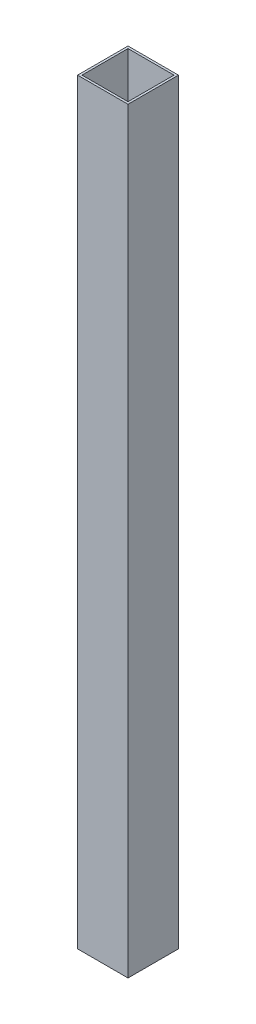
ISO-10303-21;
HEADER;
FILE_DESCRIPTION(('STEP AP214'),'2;1');
FILE_NAME('part.step','',(''),(''),'','','');
FILE_SCHEMA(('AUTOMOTIVE_DESIGN { 1 0 10303 214 1 1 1 1 }'));
ENDSEC;
DATA;
#1=APPLICATION_CONTEXT('core data for automotive mechanical design processes');
#2=APPLICATION_PROTOCOL_DEFINITION('international standard','automotive_design',2000,#1);
#3=PRODUCT_CONTEXT('',#1,'mechanical');
#4=PRODUCT('Part','Part','',(#3));
#5=PRODUCT_RELATED_PRODUCT_CATEGORY('part','',(#4));
#6=PRODUCT_DEFINITION_FORMATION('','',#4);
#7=PRODUCT_DEFINITION_CONTEXT('part definition',#1,'design');
#8=PRODUCT_DEFINITION('design','',#6,#7);
#9=PRODUCT_DEFINITION_SHAPE('','',#8);
#10=(LENGTH_UNIT() NAMED_UNIT(*) SI_UNIT(.MILLI.,.METRE.));
#11=(NAMED_UNIT(*) PLANE_ANGLE_UNIT() SI_UNIT($,.RADIAN.));
#12=(NAMED_UNIT(*) SI_UNIT($,.STERADIAN.) SOLID_ANGLE_UNIT());
#13=UNCERTAINTY_MEASURE_WITH_UNIT(LENGTH_MEASURE(1.E-05),#10,'distance_accuracy_value','');
#14=(GEOMETRIC_REPRESENTATION_CONTEXT(3) GLOBAL_UNCERTAINTY_ASSIGNED_CONTEXT((#13)) GLOBAL_UNIT_ASSIGNED_CONTEXT((#10,
#11,#12)) REPRESENTATION_CONTEXT('',''));
#15=CARTESIAN_POINT('',(0.,0.,0.));
#16=DIRECTION('',(0.,0.,1.));
#17=DIRECTION('',(1.,0.,0.));
#18=AXIS2_PLACEMENT_3D('',#15,#16,#17);
#19=CARTESIAN_POINT('',(0.,750.,0.));
#20=DIRECTION('',(0.,-1.,0.));
#21=DIRECTION('',(0.,0.,-1.));
#22=AXIS2_PLACEMENT_3D('',#19,#20,#21);
#23=PLANE('',#22);
#24=DIRECTION('',(1.,0.,0.));
#25=VECTOR('',#24,1.);
#26=CARTESIAN_POINT('',(50.,750.,0.));
#27=LINE('',#26,#25);
#28=CARTESIAN_POINT('',(0.,750.,0.));
#29=VERTEX_POINT('',#28);
#30=CARTESIAN_POINT('',(50.,750.,0.));
#31=VERTEX_POINT('',#30);
#32=EDGE_CURVE('E134',#29,#31,#27,.T.);
#33=ORIENTED_EDGE('',*,*,#32,.T.);
#34=DIRECTION('',(0.,0.,-1.));
#35=VECTOR('',#34,1.);
#36=CARTESIAN_POINT('',(50.,750.,-50.));
#37=LINE('',#36,#35);
#38=CARTESIAN_POINT('',(50.,750.,-50.));
#39=VERTEX_POINT('',#38);
#40=EDGE_CURVE('E137',#31,#39,#37,.T.);
#41=ORIENTED_EDGE('',*,*,#40,.T.);
#42=DIRECTION('',(-1.,0.,0.));
#43=VECTOR('',#42,1.);
#44=CARTESIAN_POINT('',(0.,750.,-50.));
#45=LINE('',#44,#43);
#46=CARTESIAN_POINT('',(0.,750.,-50.));
#47=VERTEX_POINT('',#46);
#48=EDGE_CURVE('E140',#39,#47,#45,.T.);
#49=ORIENTED_EDGE('',*,*,#48,.T.);
#50=DIRECTION('',(0.,0.,1.));
#51=VECTOR('',#50,1.);
#52=CARTESIAN_POINT('',(0.,750.,0.));
#53=LINE('',#52,#51);
#54=EDGE_CURVE('E142',#47,#29,#53,.T.);
#55=ORIENTED_EDGE('',*,*,#54,.T.);
#56=EDGE_LOOP('',(#33,#41,#49,#55));
#57=FACE_BOUND('',#56,.T.);
#58=DIRECTION('',(0.,0.,1.));
#59=VECTOR('',#58,1.);
#60=CARTESIAN_POINT('',(2.2,750.,-2.2));
#61=LINE('',#60,#59);
#62=CARTESIAN_POINT('',(2.2,750.,-47.8));
#63=VERTEX_POINT('',#62);
#64=CARTESIAN_POINT('',(2.2,750.,-2.2));
#65=VERTEX_POINT('',#64);
#66=EDGE_CURVE('E98',#63,#65,#61,.T.);
#67=ORIENTED_EDGE('',*,*,#66,.F.);
#68=DIRECTION('',(-1.,0.,0.));
#69=VECTOR('',#68,1.);
#70=CARTESIAN_POINT('',(2.2,750.,-47.8));
#71=LINE('',#70,#69);
#72=CARTESIAN_POINT('',(47.8,750.,-47.8));
#73=VERTEX_POINT('',#72);
#74=EDGE_CURVE('E120',#73,#63,#71,.T.);
#75=ORIENTED_EDGE('',*,*,#74,.F.);
#76=DIRECTION('',(0.,0.,-1.));
#77=VECTOR('',#76,1.);
#78=CARTESIAN_POINT('',(47.8,750.,-47.8));
#79=LINE('',#78,#77);
#80=CARTESIAN_POINT('',(47.8,750.,-2.2));
#81=VERTEX_POINT('',#80);
#82=EDGE_CURVE('E118',#81,#73,#79,.T.);
#83=ORIENTED_EDGE('',*,*,#82,.F.);
#84=DIRECTION('',(1.,0.,0.));
#85=VECTOR('',#84,1.);
#86=CARTESIAN_POINT('',(47.8,750.,-2.2));
#87=LINE('',#86,#85);
#88=EDGE_CURVE('E106',#65,#81,#87,.T.);
#89=ORIENTED_EDGE('',*,*,#88,.F.);
#90=EDGE_LOOP('',(#67,#75,#83,#89));
#91=FACE_BOUND('',#90,.T.);
#92=ADVANCED_FACE('F33',(#57,#91),#23,.F.);
#93=CARTESIAN_POINT('',(0.,0.,0.));
#94=DIRECTION('',(0.,-1.,0.));
#95=DIRECTION('',(0.,0.,-1.));
#96=AXIS2_PLACEMENT_3D('',#93,#94,#95);
#97=PLANE('',#96);
#98=DIRECTION('',(1.,0.,0.));
#99=VECTOR('',#98,1.);
#100=CARTESIAN_POINT('',(50.,0.,0.));
#101=LINE('',#100,#99);
#102=CARTESIAN_POINT('',(0.,0.,0.));
#103=VERTEX_POINT('',#102);
#104=CARTESIAN_POINT('',(50.,0.,0.));
#105=VERTEX_POINT('',#104);
#106=EDGE_CURVE('E114',#103,#105,#101,.T.);
#107=ORIENTED_EDGE('',*,*,#106,.F.);
#108=DIRECTION('',(0.,0.,1.));
#109=VECTOR('',#108,1.);
#110=CARTESIAN_POINT('',(0.,0.,0.));
#111=LINE('',#110,#109);
#112=CARTESIAN_POINT('',(0.,0.,-50.));
#113=VERTEX_POINT('',#112);
#114=EDGE_CURVE('E138',#113,#103,#111,.T.);
#115=ORIENTED_EDGE('',*,*,#114,.F.);
#116=DIRECTION('',(-1.,0.,0.));
#117=VECTOR('',#116,1.);
#118=CARTESIAN_POINT('',(0.,0.,-50.));
#119=LINE('',#118,#117);
#120=CARTESIAN_POINT('',(50.,0.,-50.));
#121=VERTEX_POINT('',#120);
#122=EDGE_CURVE('E149',#121,#113,#119,.T.);
#123=ORIENTED_EDGE('',*,*,#122,.F.);
#124=DIRECTION('',(0.,0.,-1.));
#125=VECTOR('',#124,1.);
#126=CARTESIAN_POINT('',(50.,0.,-50.));
#127=LINE('',#126,#125);
#128=EDGE_CURVE('E147',#105,#121,#127,.T.);
#129=ORIENTED_EDGE('',*,*,#128,.F.);
#130=EDGE_LOOP('',(#107,#115,#123,#129));
#131=FACE_BOUND('',#130,.T.);
#132=DIRECTION('',(-1.,0.,0.));
#133=VECTOR('',#132,1.);
#134=CARTESIAN_POINT('',(2.2,0.,-47.8));
#135=LINE('',#134,#133);
#136=CARTESIAN_POINT('',(47.8,0.,-47.8));
#137=VERTEX_POINT('',#136);
#138=CARTESIAN_POINT('',(2.2,0.,-47.8));
#139=VERTEX_POINT('',#138);
#140=EDGE_CURVE('E107',#137,#139,#135,.T.);
#141=ORIENTED_EDGE('',*,*,#140,.T.);
#142=DIRECTION('',(0.,0.,1.));
#143=VECTOR('',#142,1.);
#144=CARTESIAN_POINT('',(2.2,0.,-2.2));
#145=LINE('',#144,#143);
#146=CARTESIAN_POINT('',(2.2,0.,-2.2));
#147=VERTEX_POINT('',#146);
#148=EDGE_CURVE('E56',#139,#147,#145,.T.);
#149=ORIENTED_EDGE('',*,*,#148,.T.);
#150=DIRECTION('',(1.,0.,0.));
#151=VECTOR('',#150,1.);
#152=CARTESIAN_POINT('',(47.8,0.,-2.2));
#153=LINE('',#152,#151);
#154=CARTESIAN_POINT('',(47.8,0.,-2.2));
#155=VERTEX_POINT('',#154);
#156=EDGE_CURVE('E113',#147,#155,#153,.T.);
#157=ORIENTED_EDGE('',*,*,#156,.T.);
#158=DIRECTION('',(0.,0.,-1.));
#159=VECTOR('',#158,1.);
#160=CARTESIAN_POINT('',(47.8,0.,-47.8));
#161=LINE('',#160,#159);
#162=EDGE_CURVE('E126',#155,#137,#161,.T.);
#163=ORIENTED_EDGE('',*,*,#162,.T.);
#164=EDGE_LOOP('',(#141,#149,#157,#163));
#165=FACE_BOUND('',#164,.T.);
#166=ADVANCED_FACE('F167',(#131,#165),#97,.T.);
#167=CARTESIAN_POINT('',(50.,750.,0.));
#168=DIRECTION('',(0.,0.,-1.));
#169=DIRECTION('',(-1.,0.,0.));
#170=AXIS2_PLACEMENT_3D('',#167,#168,#169);
#171=PLANE('',#170);
#172=ORIENTED_EDGE('',*,*,#106,.T.);
#173=DIRECTION('',(0.,-1.,0.));
#174=VECTOR('',#173,1.);
#175=CARTESIAN_POINT('',(50.,750.,0.));
#176=LINE('',#175,#174);
#177=EDGE_CURVE('E11',#31,#105,#176,.T.);
#178=ORIENTED_EDGE('',*,*,#177,.F.);
#179=ORIENTED_EDGE('',*,*,#32,.F.);
#180=DIRECTION('',(0.,-1.,0.));
#181=VECTOR('',#180,1.);
#182=CARTESIAN_POINT('',(0.,750.,0.));
#183=LINE('',#182,#181);
#184=EDGE_CURVE('E144',#29,#103,#183,.T.);
#185=ORIENTED_EDGE('',*,*,#184,.T.);
#186=EDGE_LOOP('',(#172,#178,#179,#185));
#187=FACE_BOUND('',#186,.T.);
#188=ADVANCED_FACE('F35',(#187),#171,.F.);
#189=CARTESIAN_POINT('',(50.,750.,-50.));
#190=DIRECTION('',(-1.,0.,0.));
#191=DIRECTION('',(0.,0.,1.));
#192=AXIS2_PLACEMENT_3D('',#189,#190,#191);
#193=PLANE('',#192);
#194=ORIENTED_EDGE('',*,*,#128,.T.);
#195=DIRECTION('',(0.,-1.,0.));
#196=VECTOR('',#195,1.);
#197=CARTESIAN_POINT('',(50.,750.,-50.));
#198=LINE('',#197,#196);
#199=EDGE_CURVE('E41',#39,#121,#198,.T.);
#200=ORIENTED_EDGE('',*,*,#199,.F.);
#201=ORIENTED_EDGE('',*,*,#40,.F.);
#202=ORIENTED_EDGE('',*,*,#177,.T.);
#203=EDGE_LOOP('',(#194,#200,#201,#202));
#204=FACE_BOUND('',#203,.T.);
#205=ADVANCED_FACE('F177',(#204),#193,.F.);
#206=CARTESIAN_POINT('',(0.,750.,-50.));
#207=DIRECTION('',(0.,0.,1.));
#208=DIRECTION('',(1.,0.,0.));
#209=AXIS2_PLACEMENT_3D('',#206,#207,#208);
#210=PLANE('',#209);
#211=ORIENTED_EDGE('',*,*,#122,.T.);
#212=DIRECTION('',(0.,-1.,0.));
#213=VECTOR('',#212,1.);
#214=CARTESIAN_POINT('',(0.,750.,-50.));
#215=LINE('',#214,#213);
#216=EDGE_CURVE('E154',#47,#113,#215,.T.);
#217=ORIENTED_EDGE('',*,*,#216,.F.);
#218=ORIENTED_EDGE('',*,*,#48,.F.);
#219=ORIENTED_EDGE('',*,*,#199,.T.);
#220=EDGE_LOOP('',(#211,#217,#218,#219));
#221=FACE_BOUND('',#220,.T.);
#222=ADVANCED_FACE('F161',(#221),#210,.F.);
#223=CARTESIAN_POINT('',(0.,750.,0.));
#224=DIRECTION('',(1.,0.,0.));
#225=DIRECTION('',(0.,0.,-1.));
#226=AXIS2_PLACEMENT_3D('',#223,#224,#225);
#227=PLANE('',#226);
#228=ORIENTED_EDGE('',*,*,#114,.T.);
#229=ORIENTED_EDGE('',*,*,#184,.F.);
#230=ORIENTED_EDGE('',*,*,#54,.F.);
#231=ORIENTED_EDGE('',*,*,#216,.T.);
#232=EDGE_LOOP('',(#228,#229,#230,#231));
#233=FACE_BOUND('',#232,.T.);
#234=ADVANCED_FACE('F171',(#233),#227,.F.);
#235=CARTESIAN_POINT('',(2.2,750.,-2.2));
#236=DIRECTION('',(1.,0.,0.));
#237=DIRECTION('',(0.,0.,-1.));
#238=AXIS2_PLACEMENT_3D('',#235,#236,#237);
#239=PLANE('',#238);
#240=ORIENTED_EDGE('',*,*,#148,.F.);
#241=DIRECTION('',(0.,-1.,0.));
#242=VECTOR('',#241,1.);
#243=CARTESIAN_POINT('',(2.2,750.,-47.8));
#244=LINE('',#243,#242);
#245=EDGE_CURVE('E102',#63,#139,#244,.T.);
#246=ORIENTED_EDGE('',*,*,#245,.F.);
#247=ORIENTED_EDGE('',*,*,#66,.T.);
#248=DIRECTION('',(0.,-1.,0.));
#249=VECTOR('',#248,1.);
#250=CARTESIAN_POINT('',(2.2,750.,-2.2));
#251=LINE('',#250,#249);
#252=EDGE_CURVE('E101',#65,#147,#251,.T.);
#253=ORIENTED_EDGE('',*,*,#252,.T.);
#254=EDGE_LOOP('',(#240,#246,#247,#253));
#255=FACE_BOUND('',#254,.T.);
#256=ADVANCED_FACE('F100',(#255),#239,.T.);
#257=CARTESIAN_POINT('',(47.8,750.,-2.2));
#258=DIRECTION('',(0.,0.,-1.));
#259=DIRECTION('',(-1.,0.,0.));
#260=AXIS2_PLACEMENT_3D('',#257,#258,#259);
#261=PLANE('',#260);
#262=ORIENTED_EDGE('',*,*,#156,.F.);
#263=ORIENTED_EDGE('',*,*,#252,.F.);
#264=ORIENTED_EDGE('',*,*,#88,.T.);
#265=DIRECTION('',(0.,-1.,0.));
#266=VECTOR('',#265,1.);
#267=CARTESIAN_POINT('',(47.8,750.,-2.2));
#268=LINE('',#267,#266);
#269=EDGE_CURVE('E115',#81,#155,#268,.T.);
#270=ORIENTED_EDGE('',*,*,#269,.T.);
#271=EDGE_LOOP('',(#262,#263,#264,#270));
#272=FACE_BOUND('',#271,.T.);
#273=ADVANCED_FACE('F110',(#272),#261,.T.);
#274=CARTESIAN_POINT('',(47.8,750.,-47.8));
#275=DIRECTION('',(-1.,0.,0.));
#276=DIRECTION('',(0.,0.,1.));
#277=AXIS2_PLACEMENT_3D('',#274,#275,#276);
#278=PLANE('',#277);
#279=ORIENTED_EDGE('',*,*,#162,.F.);
#280=ORIENTED_EDGE('',*,*,#269,.F.);
#281=ORIENTED_EDGE('',*,*,#82,.T.);
#282=DIRECTION('',(0.,-1.,0.));
#283=VECTOR('',#282,1.);
#284=CARTESIAN_POINT('',(47.8,750.,-47.8));
#285=LINE('',#284,#283);
#286=EDGE_CURVE('E48',#73,#137,#285,.T.);
#287=ORIENTED_EDGE('',*,*,#286,.T.);
#288=EDGE_LOOP('',(#279,#280,#281,#287));
#289=FACE_BOUND('',#288,.T.);
#290=ADVANCED_FACE('F200',(#289),#278,.T.);
#291=CARTESIAN_POINT('',(2.2,750.,-47.8));
#292=DIRECTION('',(0.,0.,1.));
#293=DIRECTION('',(1.,0.,0.));
#294=AXIS2_PLACEMENT_3D('',#291,#292,#293);
#295=PLANE('',#294);
#296=ORIENTED_EDGE('',*,*,#140,.F.);
#297=ORIENTED_EDGE('',*,*,#286,.F.);
#298=ORIENTED_EDGE('',*,*,#74,.T.);
#299=ORIENTED_EDGE('',*,*,#245,.T.);
#300=EDGE_LOOP('',(#296,#297,#298,#299));
#301=FACE_BOUND('',#300,.T.);
#302=ADVANCED_FACE('F204',(#301),#295,.T.);
#303=CLOSED_SHELL('',(#92,#166,#188,#205,#222,#234,#256,#273,#290,#302));
#304=MANIFOLD_SOLID_BREP('B2',#303);
#305=ADVANCED_BREP_SHAPE_REPRESENTATION('',(#18,#304),#14);
#306=SHAPE_DEFINITION_REPRESENTATION(#9,#305);
ENDSEC;
END-ISO-10303-21;
